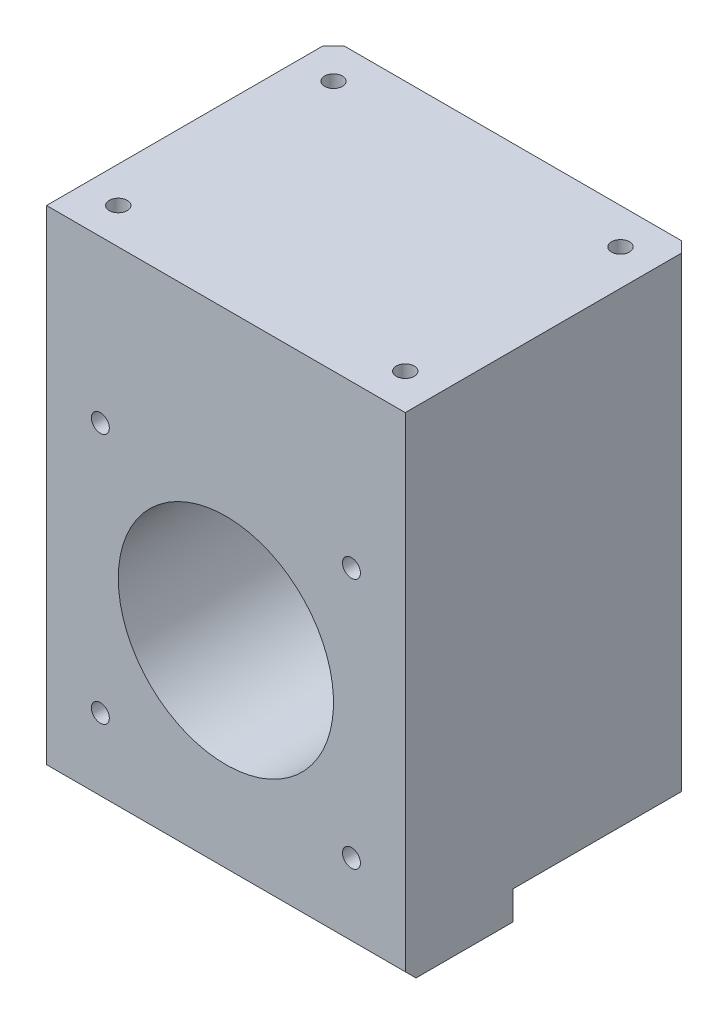
ISO-10303-21;
HEADER;
FILE_DESCRIPTION(('STEP AP214'),'2;1');
FILE_NAME('part.step','',(''),(''),'','','');
FILE_SCHEMA(('AUTOMOTIVE_DESIGN { 1 0 10303 214 1 1 1 1 }'));
ENDSEC;
DATA;
#1=APPLICATION_CONTEXT('core data for automotive mechanical design processes');
#2=APPLICATION_PROTOCOL_DEFINITION('international standard','automotive_design',2000,#1);
#3=PRODUCT_CONTEXT('',#1,'mechanical');
#4=PRODUCT('Part','Part','',(#3));
#5=PRODUCT_RELATED_PRODUCT_CATEGORY('part','',(#4));
#6=PRODUCT_DEFINITION_FORMATION('','',#4);
#7=PRODUCT_DEFINITION_CONTEXT('part definition',#1,'design');
#8=PRODUCT_DEFINITION('design','',#6,#7);
#9=PRODUCT_DEFINITION_SHAPE('','',#8);
#10=(LENGTH_UNIT() NAMED_UNIT(*) SI_UNIT(.MILLI.,.METRE.));
#11=(NAMED_UNIT(*) PLANE_ANGLE_UNIT() SI_UNIT($,.RADIAN.));
#12=(NAMED_UNIT(*) SI_UNIT($,.STERADIAN.) SOLID_ANGLE_UNIT());
#13=UNCERTAINTY_MEASURE_WITH_UNIT(LENGTH_MEASURE(1.E-05),#10,'distance_accuracy_value','');
#14=(GEOMETRIC_REPRESENTATION_CONTEXT(3) GLOBAL_UNCERTAINTY_ASSIGNED_CONTEXT((#13)) GLOBAL_UNIT_ASSIGNED_CONTEXT((#10,
#11,#12)) REPRESENTATION_CONTEXT('',''));
#15=CARTESIAN_POINT('',(0.,0.,0.));
#16=DIRECTION('',(0.,0.,1.));
#17=DIRECTION('',(1.,0.,0.));
#18=AXIS2_PLACEMENT_3D('',#15,#16,#17);
#19=CARTESIAN_POINT('',(-50.,138.,40.));
#20=DIRECTION('',(0.,0.,-1.));
#21=DIRECTION('',(-1.,0.,0.));
#22=AXIS2_PLACEMENT_3D('',#19,#20,#21);
#23=PLANE('',#22);
#24=CARTESIAN_POINT('',(35.,93.,40.));
#25=DIRECTION('',(0.,0.,1.));
#26=DIRECTION('',(1.,0.,0.));
#27=AXIS2_PLACEMENT_3D('',#24,#25,#26);
#28=CIRCLE('',#27,2.49999999999999);
#29=CARTESIAN_POINT('',(37.5,93.,40.));
#30=VERTEX_POINT('',#29);
#31=EDGE_CURVE('E178',#30,#30,#28,.T.);
#32=ORIENTED_EDGE('',*,*,#31,.F.);
#33=EDGE_LOOP('',(#32));
#34=FACE_BOUND('',#33,.T.);
#35=CARTESIAN_POINT('',(35.,23.,40.));
#36=DIRECTION('',(0.,0.,1.));
#37=DIRECTION('',(1.,0.,0.));
#38=AXIS2_PLACEMENT_3D('',#35,#36,#37);
#39=CIRCLE('',#38,2.49999999999999);
#40=CARTESIAN_POINT('',(37.5,23.,40.));
#41=VERTEX_POINT('',#40);
#42=EDGE_CURVE('E192',#41,#41,#39,.T.);
#43=ORIENTED_EDGE('',*,*,#42,.F.);
#44=EDGE_LOOP('',(#43));
#45=FACE_BOUND('',#44,.T.);
#46=CARTESIAN_POINT('',(-35.,23.,40.));
#47=DIRECTION('',(0.,0.,1.));
#48=DIRECTION('',(1.,0.,0.));
#49=AXIS2_PLACEMENT_3D('',#46,#47,#48);
#50=CIRCLE('',#49,2.49999999999999);
#51=CARTESIAN_POINT('',(-32.5,23.,40.));
#52=VERTEX_POINT('',#51);
#53=EDGE_CURVE('E200',#52,#52,#50,.T.);
#54=ORIENTED_EDGE('',*,*,#53,.F.);
#55=EDGE_LOOP('',(#54));
#56=FACE_BOUND('',#55,.T.);
#57=CARTESIAN_POINT('',(0.,58.,40.));
#58=DIRECTION('',(0.,0.,-1.));
#59=DIRECTION('',(-1.,0.,0.));
#60=AXIS2_PLACEMENT_3D('',#57,#58,#59);
#61=CIRCLE('',#60,30.);
#62=CARTESIAN_POINT('',(-30.,58.,40.));
#63=VERTEX_POINT('',#62);
#64=EDGE_CURVE('E273',#63,#63,#61,.T.);
#65=ORIENTED_EDGE('',*,*,#64,.T.);
#66=EDGE_LOOP('',(#65));
#67=FACE_BOUND('',#66,.T.);
#68=DIRECTION('',(0.,-1.,0.));
#69=VECTOR('',#68,1.);
#70=CARTESIAN_POINT('',(-50.,138.,40.));
#71=LINE('',#70,#69);
#72=CARTESIAN_POINT('',(-50.,138.,40.));
#73=VERTEX_POINT('',#72);
#74=CARTESIAN_POINT('',(-50.,3.,40.));
#75=VERTEX_POINT('',#74);
#76=EDGE_CURVE('E361',#73,#75,#71,.T.);
#77=ORIENTED_EDGE('',*,*,#76,.T.);
#78=DIRECTION('',(1.,0.,0.));
#79=VECTOR('',#78,1.);
#80=CARTESIAN_POINT('',(50.,3.,40.));
#81=LINE('',#80,#79);
#82=CARTESIAN_POINT('',(50.,3.,40.));
#83=VERTEX_POINT('',#82);
#84=EDGE_CURVE('E365',#75,#83,#81,.T.);
#85=ORIENTED_EDGE('',*,*,#84,.T.);
#86=DIRECTION('',(0.,-1.,0.));
#87=VECTOR('',#86,1.);
#88=CARTESIAN_POINT('',(50.,138.,40.));
#89=LINE('',#88,#87);
#90=CARTESIAN_POINT('',(50.,138.,40.));
#91=VERTEX_POINT('',#90);
#92=EDGE_CURVE('E352',#91,#83,#89,.T.);
#93=ORIENTED_EDGE('',*,*,#92,.F.);
#94=DIRECTION('',(1.,0.,0.));
#95=VECTOR('',#94,1.);
#96=CARTESIAN_POINT('',(-50.,138.,40.));
#97=LINE('',#96,#95);
#98=EDGE_CURVE('E349',#73,#91,#97,.T.);
#99=ORIENTED_EDGE('',*,*,#98,.F.);
#100=EDGE_LOOP('',(#77,#85,#93,#99));
#101=FACE_BOUND('',#100,.T.);
#102=CARTESIAN_POINT('',(-35.,93.,40.));
#103=DIRECTION('',(0.,0.,1.));
#104=DIRECTION('',(1.,0.,0.));
#105=AXIS2_PLACEMENT_3D('',#102,#103,#104);
#106=CIRCLE('',#105,2.49999999999999);
#107=CARTESIAN_POINT('',(-32.5,93.,40.));
#108=VERTEX_POINT('',#107);
#109=EDGE_CURVE('E179',#108,#108,#106,.T.);
#110=ORIENTED_EDGE('',*,*,#109,.F.);
#111=EDGE_LOOP('',(#110));
#112=FACE_BOUND('',#111,.T.);
#113=ADVANCED_FACE('F48',(#34,#45,#56,#67,#101,#112),#23,.F.);
#114=CARTESIAN_POINT('',(50.,138.,40.));
#115=DIRECTION('',(-1.,0.,0.));
#116=DIRECTION('',(0.,0.,1.));
#117=AXIS2_PLACEMENT_3D('',#114,#115,#116);
#118=PLANE('',#117);
#119=ORIENTED_EDGE('',*,*,#92,.T.);
#120=DIRECTION('',(0.,-0.707106781186548,-0.707106781186548));
#121=VECTOR('',#120,1.);
#122=CARTESIAN_POINT('',(50.,3.,40.));
#123=LINE('',#122,#121);
#124=CARTESIAN_POINT('',(50.,0.,37.));
#125=VERTEX_POINT('',#124);
#126=EDGE_CURVE('E372',#83,#125,#123,.T.);
#127=ORIENTED_EDGE('',*,*,#126,.T.);
#128=DIRECTION('',(0.,0.,-1.));
#129=VECTOR('',#128,1.);
#130=CARTESIAN_POINT('',(50.,0.,40.));
#131=LINE('',#130,#129);
#132=CARTESIAN_POINT('',(50.,0.,10.));
#133=VERTEX_POINT('',#132);
#134=EDGE_CURVE('E335',#125,#133,#131,.T.);
#135=ORIENTED_EDGE('',*,*,#134,.T.);
#136=DIRECTION('',(0.,-1.,0.));
#137=VECTOR('',#136,1.);
#138=CARTESIAN_POINT('',(50.,8.,10.));
#139=LINE('',#138,#137);
#140=CARTESIAN_POINT('',(50.,8.,10.));
#141=VERTEX_POINT('',#140);
#142=EDGE_CURVE('E328',#141,#133,#139,.T.);
#143=ORIENTED_EDGE('',*,*,#142,.F.);
#144=DIRECTION('',(0.,0.,1.));
#145=VECTOR('',#144,1.);
#146=CARTESIAN_POINT('',(50.,8.,-40.));
#147=LINE('',#146,#145);
#148=CARTESIAN_POINT('',(50.,8.,-37.));
#149=VERTEX_POINT('',#148);
#150=EDGE_CURVE('E321',#149,#141,#147,.T.);
#151=ORIENTED_EDGE('',*,*,#150,.F.);
#152=DIRECTION('',(0.,1.,0.));
#153=VECTOR('',#152,1.);
#154=CARTESIAN_POINT('',(50.,138.,-37.));
#155=LINE('',#154,#153);
#156=CARTESIAN_POINT('',(50.,138.,-37.));
#157=VERTEX_POINT('',#156);
#158=EDGE_CURVE('E369',#149,#157,#155,.T.);
#159=ORIENTED_EDGE('',*,*,#158,.T.);
#160=DIRECTION('',(0.,0.,-1.));
#161=VECTOR('',#160,1.);
#162=CARTESIAN_POINT('',(50.,138.,40.));
#163=LINE('',#162,#161);
#164=EDGE_CURVE('E339',#91,#157,#163,.T.);
#165=ORIENTED_EDGE('',*,*,#164,.F.);
#166=EDGE_LOOP('',(#119,#127,#135,#143,#151,#159,#165));
#167=FACE_BOUND('',#166,.T.);
#168=ADVANCED_FACE('F420',(#167),#118,.F.);
#169=CARTESIAN_POINT('',(-50.,138.,-40.));
#170=DIRECTION('',(0.,0.,1.));
#171=DIRECTION('',(1.,0.,0.));
#172=AXIS2_PLACEMENT_3D('',#169,#170,#171);
#173=PLANE('',#172);
#174=CARTESIAN_POINT('',(35.,23.,-40.));
#175=DIRECTION('',(0.,0.,-1.));
#176=DIRECTION('',(-1.,0.,0.));
#177=AXIS2_PLACEMENT_3D('',#174,#175,#176);
#178=CIRCLE('',#177,2.49999999999999);
#179=CARTESIAN_POINT('',(32.5,23.,-40.));
#180=VERTEX_POINT('',#179);
#181=EDGE_CURVE('E208',#180,#180,#178,.T.);
#182=ORIENTED_EDGE('',*,*,#181,.F.);
#183=EDGE_LOOP('',(#182));
#184=FACE_BOUND('',#183,.T.);
#185=CARTESIAN_POINT('',(35.,93.,-40.));
#186=DIRECTION('',(0.,0.,-1.));
#187=DIRECTION('',(-1.,0.,0.));
#188=AXIS2_PLACEMENT_3D('',#185,#186,#187);
#189=CIRCLE('',#188,2.49999999999999);
#190=CARTESIAN_POINT('',(32.5,93.,-40.));
#191=VERTEX_POINT('',#190);
#192=EDGE_CURVE('E216',#191,#191,#189,.T.);
#193=ORIENTED_EDGE('',*,*,#192,.F.);
#194=EDGE_LOOP('',(#193));
#195=FACE_BOUND('',#194,.T.);
#196=CARTESIAN_POINT('',(-35.,93.,-40.));
#197=DIRECTION('',(0.,0.,-1.));
#198=DIRECTION('',(-1.,0.,0.));
#199=AXIS2_PLACEMENT_3D('',#196,#197,#198);
#200=CIRCLE('',#199,2.49999999999999);
#201=CARTESIAN_POINT('',(-37.5,93.,-40.));
#202=VERTEX_POINT('',#201);
#203=EDGE_CURVE('E224',#202,#202,#200,.T.);
#204=ORIENTED_EDGE('',*,*,#203,.F.);
#205=EDGE_LOOP('',(#204));
#206=FACE_BOUND('',#205,.T.);
#207=CARTESIAN_POINT('',(-35.,23.,-40.));
#208=DIRECTION('',(0.,0.,-1.));
#209=DIRECTION('',(-1.,0.,0.));
#210=AXIS2_PLACEMENT_3D('',#207,#208,#209);
#211=CIRCLE('',#210,2.49999999999999);
#212=CARTESIAN_POINT('',(-37.5,23.,-40.));
#213=VERTEX_POINT('',#212);
#214=EDGE_CURVE('E232',#213,#213,#211,.T.);
#215=ORIENTED_EDGE('',*,*,#214,.F.);
#216=EDGE_LOOP('',(#215));
#217=FACE_BOUND('',#216,.T.);
#218=CARTESIAN_POINT('',(0.,58.,-40.));
#219=DIRECTION('',(0.,0.,-1.));
#220=DIRECTION('',(-1.,0.,0.));
#221=AXIS2_PLACEMENT_3D('',#218,#219,#220);
#222=CIRCLE('',#221,30.);
#223=CARTESIAN_POINT('',(-30.,58.,-40.));
#224=VERTEX_POINT('',#223);
#225=EDGE_CURVE('E272',#224,#224,#222,.T.);
#226=ORIENTED_EDGE('',*,*,#225,.F.);
#227=EDGE_LOOP('',(#226));
#228=FACE_BOUND('',#227,.T.);
#229=DIRECTION('',(1.,0.,0.));
#230=VECTOR('',#229,1.);
#231=CARTESIAN_POINT('',(-50.,8.,-40.));
#232=LINE('',#231,#230);
#233=CARTESIAN_POINT('',(-47.,8.,-40.));
#234=VERTEX_POINT('',#233);
#235=CARTESIAN_POINT('',(47.,8.,-40.));
#236=VERTEX_POINT('',#235);
#237=EDGE_CURVE('E317',#234,#236,#232,.T.);
#238=ORIENTED_EDGE('',*,*,#237,.F.);
#239=DIRECTION('',(0.,1.,0.));
#240=VECTOR('',#239,1.);
#241=CARTESIAN_POINT('',(-47.,138.,-40.));
#242=LINE('',#241,#240);
#243=CARTESIAN_POINT('',(-47.,138.,-40.));
#244=VERTEX_POINT('',#243);
#245=EDGE_CURVE('E65',#234,#244,#242,.T.);
#246=ORIENTED_EDGE('',*,*,#245,.T.);
#247=DIRECTION('',(-1.,0.,0.));
#248=VECTOR('',#247,1.);
#249=CARTESIAN_POINT('',(-50.,138.,-40.));
#250=LINE('',#249,#248);
#251=CARTESIAN_POINT('',(47.,138.,-40.));
#252=VERTEX_POINT('',#251);
#253=EDGE_CURVE('E342',#252,#244,#250,.T.);
#254=ORIENTED_EDGE('',*,*,#253,.F.);
#255=DIRECTION('',(0.,-1.,0.));
#256=VECTOR('',#255,1.);
#257=CARTESIAN_POINT('',(47.,138.,-40.));
#258=LINE('',#257,#256);
#259=EDGE_CURVE('E391',#252,#236,#258,.T.);
#260=ORIENTED_EDGE('',*,*,#259,.T.);
#261=EDGE_LOOP('',(#238,#246,#254,#260));
#262=FACE_BOUND('',#261,.T.);
#263=ADVANCED_FACE('F398',(#184,#195,#206,#217,#228,#262),#173,.F.);
#264=CARTESIAN_POINT('',(-50.,138.,40.));
#265=DIRECTION('',(1.,0.,0.));
#266=DIRECTION('',(0.,0.,-1.));
#267=AXIS2_PLACEMENT_3D('',#264,#265,#266);
#268=PLANE('',#267);
#269=DIRECTION('',(0.,0.,1.));
#270=VECTOR('',#269,1.);
#271=CARTESIAN_POINT('',(-50.,0.,40.));
#272=LINE('',#271,#270);
#273=CARTESIAN_POINT('',(-50.,0.,10.));
#274=VERTEX_POINT('',#273);
#275=CARTESIAN_POINT('',(-50.,0.,37.));
#276=VERTEX_POINT('',#275);
#277=EDGE_CURVE('E343',#274,#276,#272,.T.);
#278=ORIENTED_EDGE('',*,*,#277,.T.);
#279=DIRECTION('',(0.,0.707106781186548,0.707106781186548));
#280=VECTOR('',#279,1.);
#281=CARTESIAN_POINT('',(-50.,3.,40.));
#282=LINE('',#281,#280);
#283=EDGE_CURVE('E382',#276,#75,#282,.T.);
#284=ORIENTED_EDGE('',*,*,#283,.T.);
#285=ORIENTED_EDGE('',*,*,#76,.F.);
#286=DIRECTION('',(0.,0.,1.));
#287=VECTOR('',#286,1.);
#288=CARTESIAN_POINT('',(-50.,138.,40.));
#289=LINE('',#288,#287);
#290=CARTESIAN_POINT('',(-50.,138.,-37.));
#291=VERTEX_POINT('',#290);
#292=EDGE_CURVE('E346',#291,#73,#289,.T.);
#293=ORIENTED_EDGE('',*,*,#292,.F.);
#294=DIRECTION('',(0.,-1.,0.));
#295=VECTOR('',#294,1.);
#296=CARTESIAN_POINT('',(-50.,138.,-37.));
#297=LINE('',#296,#295);
#298=CARTESIAN_POINT('',(-50.,8.,-37.));
#299=VERTEX_POINT('',#298);
#300=EDGE_CURVE('E378',#291,#299,#297,.T.);
#301=ORIENTED_EDGE('',*,*,#300,.T.);
#302=DIRECTION('',(0.,0.,-1.));
#303=VECTOR('',#302,1.);
#304=CARTESIAN_POINT('',(-50.,8.,-40.));
#305=LINE('',#304,#303);
#306=CARTESIAN_POINT('',(-50.,8.,10.));
#307=VERTEX_POINT('',#306);
#308=EDGE_CURVE('E313',#307,#299,#305,.T.);
#309=ORIENTED_EDGE('',*,*,#308,.F.);
#310=DIRECTION('',(0.,-1.,0.));
#311=VECTOR('',#310,1.);
#312=CARTESIAN_POINT('',(-50.,8.,10.));
#313=LINE('',#312,#311);
#314=EDGE_CURVE('E331',#307,#274,#313,.T.);
#315=ORIENTED_EDGE('',*,*,#314,.T.);
#316=EDGE_LOOP('',(#278,#284,#285,#293,#301,#309,#315));
#317=FACE_BOUND('',#316,.T.);
#318=ADVANCED_FACE('F410',(#317),#268,.F.);
#319=CARTESIAN_POINT('',(0.,138.,0.));
#320=DIRECTION('',(0.,-1.,0.));
#321=DIRECTION('',(0.,0.,-1.));
#322=AXIS2_PLACEMENT_3D('',#319,#320,#321);
#323=PLANE('',#322);
#324=CARTESIAN_POINT('',(-40.,138.,-30.));
#325=DIRECTION('',(0.,1.,0.));
#326=DIRECTION('',(0.,0.,1.));
#327=AXIS2_PLACEMENT_3D('',#324,#325,#326);
#328=CIRCLE('',#327,2.49999999999999);
#329=CARTESIAN_POINT('',(-40.,138.,-27.5));
#330=VERTEX_POINT('',#329);
#331=EDGE_CURVE('E240',#330,#330,#328,.T.);
#332=ORIENTED_EDGE('',*,*,#331,.F.);
#333=EDGE_LOOP('',(#332));
#334=FACE_BOUND('',#333,.T.);
#335=CARTESIAN_POINT('',(-40.,138.,30.));
#336=DIRECTION('',(0.,1.,0.));
#337=DIRECTION('',(0.,0.,1.));
#338=AXIS2_PLACEMENT_3D('',#335,#336,#337);
#339=CIRCLE('',#338,2.49999999999999);
#340=CARTESIAN_POINT('',(-40.,138.,32.5));
#341=VERTEX_POINT('',#340);
#342=EDGE_CURVE('E248',#341,#341,#339,.T.);
#343=ORIENTED_EDGE('',*,*,#342,.F.);
#344=EDGE_LOOP('',(#343));
#345=FACE_BOUND('',#344,.T.);
#346=CARTESIAN_POINT('',(40.,138.,30.));
#347=DIRECTION('',(0.,1.,0.));
#348=DIRECTION('',(0.,0.,1.));
#349=AXIS2_PLACEMENT_3D('',#346,#347,#348);
#350=CIRCLE('',#349,2.49999999999999);
#351=CARTESIAN_POINT('',(40.,138.,32.5));
#352=VERTEX_POINT('',#351);
#353=EDGE_CURVE('E256',#352,#352,#350,.T.);
#354=ORIENTED_EDGE('',*,*,#353,.F.);
#355=EDGE_LOOP('',(#354));
#356=FACE_BOUND('',#355,.T.);
#357=CARTESIAN_POINT('',(40.,138.,-30.));
#358=DIRECTION('',(0.,1.,0.));
#359=DIRECTION('',(0.,0.,1.));
#360=AXIS2_PLACEMENT_3D('',#357,#358,#359);
#361=CIRCLE('',#360,2.49999999999999);
#362=CARTESIAN_POINT('',(40.,138.,-27.5));
#363=VERTEX_POINT('',#362);
#364=EDGE_CURVE('E264',#363,#363,#361,.T.);
#365=ORIENTED_EDGE('',*,*,#364,.F.);
#366=EDGE_LOOP('',(#365));
#367=FACE_BOUND('',#366,.T.);
#368=ORIENTED_EDGE('',*,*,#253,.T.);
#369=DIRECTION('',(0.707106781186551,0.,-0.707106781186544));
#370=VECTOR('',#369,1.);
#371=CARTESIAN_POINT('',(-50.,138.,-37.));
#372=LINE('',#371,#370);
#373=EDGE_CURVE('E11',#244,#291,#372,.F.);
#374=ORIENTED_EDGE('',*,*,#373,.T.);
#375=ORIENTED_EDGE('',*,*,#292,.T.);
#376=ORIENTED_EDGE('',*,*,#98,.T.);
#377=ORIENTED_EDGE('',*,*,#164,.T.);
#378=DIRECTION('',(0.707106781186544,0.,0.707106781186551));
#379=VECTOR('',#378,1.);
#380=CARTESIAN_POINT('',(47.,138.,-40.));
#381=LINE('',#380,#379);
#382=EDGE_CURVE('E58',#157,#252,#381,.F.);
#383=ORIENTED_EDGE('',*,*,#382,.T.);
#384=EDGE_LOOP('',(#368,#374,#375,#376,#377,#383));
#385=FACE_BOUND('',#384,.T.);
#386=ADVANCED_FACE('F413',(#334,#345,#356,#367,#385),#323,.F.);
#387=CARTESIAN_POINT('',(0.,0.,0.));
#388=DIRECTION('',(0.,-1.,0.));
#389=DIRECTION('',(0.,0.,-1.));
#390=AXIS2_PLACEMENT_3D('',#387,#388,#389);
#391=PLANE('',#390);
#392=ORIENTED_EDGE('',*,*,#134,.F.);
#393=DIRECTION('',(-1.,0.,0.));
#394=VECTOR('',#393,1.);
#395=CARTESIAN_POINT('',(-50.,0.,37.));
#396=LINE('',#395,#394);
#397=EDGE_CURVE('E375',#125,#276,#396,.T.);
#398=ORIENTED_EDGE('',*,*,#397,.T.);
#399=ORIENTED_EDGE('',*,*,#277,.F.);
#400=DIRECTION('',(-1.,0.,0.));
#401=VECTOR('',#400,1.);
#402=CARTESIAN_POINT('',(-50.,0.,10.));
#403=LINE('',#402,#401);
#404=EDGE_CURVE('E312',#133,#274,#403,.T.);
#405=ORIENTED_EDGE('',*,*,#404,.F.);
#406=EDGE_LOOP('',(#392,#398,#399,#405));
#407=FACE_BOUND('',#406,.T.);
#408=ADVANCED_FACE('F439',(#407),#391,.T.);
#409=CARTESIAN_POINT('',(-50.,8.,10.));
#410=DIRECTION('',(0.,0.,1.));
#411=DIRECTION('',(1.,0.,0.));
#412=AXIS2_PLACEMENT_3D('',#409,#410,#411);
#413=PLANE('',#412);
#414=ORIENTED_EDGE('',*,*,#404,.T.);
#415=ORIENTED_EDGE('',*,*,#314,.F.);
#416=DIRECTION('',(-1.,0.,0.));
#417=VECTOR('',#416,1.);
#418=CARTESIAN_POINT('',(-50.,8.,10.));
#419=LINE('',#418,#417);
#420=EDGE_CURVE('E324',#141,#307,#419,.T.);
#421=ORIENTED_EDGE('',*,*,#420,.F.);
#422=ORIENTED_EDGE('',*,*,#142,.T.);
#423=EDGE_LOOP('',(#414,#415,#421,#422));
#424=FACE_BOUND('',#423,.T.);
#425=ADVANCED_FACE('F468',(#424),#413,.F.);
#426=CARTESIAN_POINT('',(0.,8.,0.));
#427=DIRECTION('',(0.,1.,0.));
#428=DIRECTION('',(0.,0.,1.));
#429=AXIS2_PLACEMENT_3D('',#426,#427,#428);
#430=PLANE('',#429);
#431=CARTESIAN_POINT('',(40.,8.,-25.));
#432=DIRECTION('',(0.,-1.,0.));
#433=DIRECTION('',(0.,0.,-1.));
#434=AXIS2_PLACEMENT_3D('',#431,#432,#433);
#435=CIRCLE('',#434,2.49999999999999);
#436=CARTESIAN_POINT('',(40.,8.,-27.5));
#437=VERTEX_POINT('',#436);
#438=EDGE_CURVE('E277',#437,#437,#435,.T.);
#439=ORIENTED_EDGE('',*,*,#438,.F.);
#440=EDGE_LOOP('',(#439));
#441=FACE_BOUND('',#440,.T.);
#442=CARTESIAN_POINT('',(40.,8.,0.));
#443=DIRECTION('',(0.,-1.,0.));
#444=DIRECTION('',(0.,0.,-1.));
#445=AXIS2_PLACEMENT_3D('',#442,#443,#444);
#446=CIRCLE('',#445,2.49999999999999);
#447=CARTESIAN_POINT('',(40.,8.,-2.49999999999998));
#448=VERTEX_POINT('',#447);
#449=EDGE_CURVE('E288',#448,#448,#446,.T.);
#450=ORIENTED_EDGE('',*,*,#449,.F.);
#451=EDGE_LOOP('',(#450));
#452=FACE_BOUND('',#451,.T.);
#453=CARTESIAN_POINT('',(-40.,8.,0.));
#454=DIRECTION('',(0.,-1.,0.));
#455=DIRECTION('',(0.,0.,-1.));
#456=AXIS2_PLACEMENT_3D('',#453,#454,#455);
#457=CIRCLE('',#456,2.49999999999999);
#458=CARTESIAN_POINT('',(-40.,8.,-2.49999999999998));
#459=VERTEX_POINT('',#458);
#460=EDGE_CURVE('E296',#459,#459,#457,.T.);
#461=ORIENTED_EDGE('',*,*,#460,.F.);
#462=EDGE_LOOP('',(#461));
#463=FACE_BOUND('',#462,.T.);
#464=CARTESIAN_POINT('',(-40.,8.,-25.));
#465=DIRECTION('',(0.,-1.,0.));
#466=DIRECTION('',(0.,0.,-1.));
#467=AXIS2_PLACEMENT_3D('',#464,#465,#466);
#468=CIRCLE('',#467,2.49999999999999);
#469=CARTESIAN_POINT('',(-40.,8.,-27.5));
#470=VERTEX_POINT('',#469);
#471=EDGE_CURVE('E304',#470,#470,#468,.T.);
#472=ORIENTED_EDGE('',*,*,#471,.F.);
#473=EDGE_LOOP('',(#472));
#474=FACE_BOUND('',#473,.T.);
#475=ORIENTED_EDGE('',*,*,#308,.T.);
#476=DIRECTION('',(-0.707106781186551,0.,0.707106781186544));
#477=VECTOR('',#476,1.);
#478=CARTESIAN_POINT('',(-50.,8.00000000000001,-37.));
#479=LINE('',#478,#477);
#480=EDGE_CURVE('E388',#299,#234,#479,.F.);
#481=ORIENTED_EDGE('',*,*,#480,.T.);
#482=ORIENTED_EDGE('',*,*,#237,.T.);
#483=DIRECTION('',(-0.707106781186544,0.,-0.707106781186551));
#484=VECTOR('',#483,1.);
#485=CARTESIAN_POINT('',(47.,8.00000000000001,-40.));
#486=LINE('',#485,#484);
#487=EDGE_CURVE('E385',#236,#149,#486,.F.);
#488=ORIENTED_EDGE('',*,*,#487,.T.);
#489=ORIENTED_EDGE('',*,*,#150,.T.);
#490=ORIENTED_EDGE('',*,*,#420,.T.);
#491=EDGE_LOOP('',(#475,#481,#482,#488,#489,#490));
#492=FACE_BOUND('',#491,.T.);
#493=ADVANCED_FACE('F401',(#441,#452,#463,#474,#492),#430,.F.);
#494=CARTESIAN_POINT('',(-40.,23.,-25.));
#495=DIRECTION('',(0.,-1.,0.));
#496=DIRECTION('',(0.,0.,-1.));
#497=AXIS2_PLACEMENT_3D('',#494,#495,#496);
#498=CONICAL_SURFACE('',#497,2.49999999999999,1.02974425867665);
#499=CARTESIAN_POINT('',(-40.,24.5021515475689,-25.));
#500=VERTEX_POINT('',#499);
#501=VERTEX_LOOP('',#500);
#502=FACE_BOUND('',#501,.T.);
#503=CARTESIAN_POINT('',(-40.,23.,-25.));
#504=DIRECTION('',(0.,-1.,0.));
#505=DIRECTION('',(0.,0.,-1.));
#506=AXIS2_PLACEMENT_3D('',#503,#504,#505);
#507=CIRCLE('',#506,2.49999999999999);
#508=CARTESIAN_POINT('',(-40.,23.,-27.5));
#509=VERTEX_POINT('',#508);
#510=EDGE_CURVE('E308',#509,#509,#507,.T.);
#511=ORIENTED_EDGE('',*,*,#510,.T.);
#512=EDGE_LOOP('',(#511));
#513=FACE_BOUND('',#512,.T.);
#514=ADVANCED_FACE('F475',(#502,#513),#498,.F.);
#515=CARTESIAN_POINT('',(-40.,8.,-25.));
#516=DIRECTION('',(0.,-1.,0.));
#517=DIRECTION('',(0.,0.,-1.));
#518=AXIS2_PLACEMENT_3D('',#515,#516,#517);
#519=CYLINDRICAL_SURFACE('',#518,2.49999999999999);
#520=ORIENTED_EDGE('',*,*,#510,.F.);
#521=EDGE_LOOP('',(#520));
#522=FACE_BOUND('',#521,.T.);
#523=ORIENTED_EDGE('',*,*,#471,.T.);
#524=EDGE_LOOP('',(#523));
#525=FACE_BOUND('',#524,.T.);
#526=ADVANCED_FACE('F536',(#522,#525),#519,.F.);
#527=CARTESIAN_POINT('',(-40.,23.,0.));
#528=DIRECTION('',(0.,-1.,0.));
#529=DIRECTION('',(0.,0.,-1.));
#530=AXIS2_PLACEMENT_3D('',#527,#528,#529);
#531=CONICAL_SURFACE('',#530,2.49999999999999,1.02974425867665);
#532=CARTESIAN_POINT('',(-40.,24.5021515475689,0.));
#533=VERTEX_POINT('',#532);
#534=VERTEX_LOOP('',#533);
#535=FACE_BOUND('',#534,.T.);
#536=CARTESIAN_POINT('',(-40.,23.,0.));
#537=DIRECTION('',(0.,-1.,0.));
#538=DIRECTION('',(0.,0.,-1.));
#539=AXIS2_PLACEMENT_3D('',#536,#537,#538);
#540=CIRCLE('',#539,2.49999999999999);
#541=CARTESIAN_POINT('',(-40.,23.,-2.49999999999998));
#542=VERTEX_POINT('',#541);
#543=EDGE_CURVE('E300',#542,#542,#540,.T.);
#544=ORIENTED_EDGE('',*,*,#543,.T.);
#545=EDGE_LOOP('',(#544));
#546=FACE_BOUND('',#545,.T.);
#547=ADVANCED_FACE('F532',(#535,#546),#531,.F.);
#548=CARTESIAN_POINT('',(-40.,8.,0.));
#549=DIRECTION('',(0.,-1.,0.));
#550=DIRECTION('',(0.,0.,-1.));
#551=AXIS2_PLACEMENT_3D('',#548,#549,#550);
#552=CYLINDRICAL_SURFACE('',#551,2.49999999999999);
#553=ORIENTED_EDGE('',*,*,#543,.F.);
#554=EDGE_LOOP('',(#553));
#555=FACE_BOUND('',#554,.T.);
#556=ORIENTED_EDGE('',*,*,#460,.T.);
#557=EDGE_LOOP('',(#556));
#558=FACE_BOUND('',#557,.T.);
#559=ADVANCED_FACE('F528',(#555,#558),#552,.F.);
#560=CARTESIAN_POINT('',(40.,23.,0.));
#561=DIRECTION('',(0.,-1.,0.));
#562=DIRECTION('',(0.,0.,-1.));
#563=AXIS2_PLACEMENT_3D('',#560,#561,#562);
#564=CONICAL_SURFACE('',#563,2.49999999999999,1.02974425867665);
#565=CARTESIAN_POINT('',(40.,24.5021515475689,0.));
#566=VERTEX_POINT('',#565);
#567=VERTEX_LOOP('',#566);
#568=FACE_BOUND('',#567,.T.);
#569=CARTESIAN_POINT('',(40.,23.,0.));
#570=DIRECTION('',(0.,-1.,0.));
#571=DIRECTION('',(0.,0.,-1.));
#572=AXIS2_PLACEMENT_3D('',#569,#570,#571);
#573=CIRCLE('',#572,2.49999999999999);
#574=CARTESIAN_POINT('',(40.,23.,-2.49999999999998));
#575=VERTEX_POINT('',#574);
#576=EDGE_CURVE('E292',#575,#575,#573,.T.);
#577=ORIENTED_EDGE('',*,*,#576,.T.);
#578=EDGE_LOOP('',(#577));
#579=FACE_BOUND('',#578,.T.);
#580=ADVANCED_FACE('F524',(#568,#579),#564,.F.);
#581=CARTESIAN_POINT('',(40.,8.,0.));
#582=DIRECTION('',(0.,-1.,0.));
#583=DIRECTION('',(0.,0.,-1.));
#584=AXIS2_PLACEMENT_3D('',#581,#582,#583);
#585=CYLINDRICAL_SURFACE('',#584,2.49999999999999);
#586=ORIENTED_EDGE('',*,*,#576,.F.);
#587=EDGE_LOOP('',(#586));
#588=FACE_BOUND('',#587,.T.);
#589=ORIENTED_EDGE('',*,*,#449,.T.);
#590=EDGE_LOOP('',(#589));
#591=FACE_BOUND('',#590,.T.);
#592=ADVANCED_FACE('F520',(#588,#591),#585,.F.);
#593=CARTESIAN_POINT('',(40.,23.,-25.));
#594=DIRECTION('',(0.,-1.,0.));
#595=DIRECTION('',(0.,0.,-1.));
#596=AXIS2_PLACEMENT_3D('',#593,#594,#595);
#597=CONICAL_SURFACE('',#596,2.49999999999999,1.02974425867665);
#598=CARTESIAN_POINT('',(40.,24.5021515475689,-25.));
#599=VERTEX_POINT('',#598);
#600=VERTEX_LOOP('',#599);
#601=FACE_BOUND('',#600,.T.);
#602=CARTESIAN_POINT('',(40.,23.,-25.));
#603=DIRECTION('',(0.,-1.,0.));
#604=DIRECTION('',(0.,0.,-1.));
#605=AXIS2_PLACEMENT_3D('',#602,#603,#604);
#606=CIRCLE('',#605,2.49999999999999);
#607=CARTESIAN_POINT('',(40.,23.,-27.5));
#608=VERTEX_POINT('',#607);
#609=EDGE_CURVE('E284',#608,#608,#606,.T.);
#610=ORIENTED_EDGE('',*,*,#609,.T.);
#611=EDGE_LOOP('',(#610));
#612=FACE_BOUND('',#611,.T.);
#613=ADVANCED_FACE('F516',(#601,#612),#597,.F.);
#614=CARTESIAN_POINT('',(40.,8.,-25.));
#615=DIRECTION('',(0.,-1.,0.));
#616=DIRECTION('',(0.,0.,-1.));
#617=AXIS2_PLACEMENT_3D('',#614,#615,#616);
#618=CYLINDRICAL_SURFACE('',#617,2.49999999999999);
#619=ORIENTED_EDGE('',*,*,#609,.F.);
#620=EDGE_LOOP('',(#619));
#621=FACE_BOUND('',#620,.T.);
#622=ORIENTED_EDGE('',*,*,#438,.T.);
#623=EDGE_LOOP('',(#622));
#624=FACE_BOUND('',#623,.T.);
#625=ADVANCED_FACE('F512',(#621,#624),#618,.F.);
#626=CARTESIAN_POINT('',(0.,58.,40.));
#627=DIRECTION('',(0.,0.,-1.));
#628=DIRECTION('',(-1.,0.,0.));
#629=AXIS2_PLACEMENT_3D('',#626,#627,#628);
#630=CYLINDRICAL_SURFACE('',#629,30.);
#631=ORIENTED_EDGE('',*,*,#64,.F.);
#632=EDGE_LOOP('',(#631));
#633=FACE_BOUND('',#632,.T.);
#634=ORIENTED_EDGE('',*,*,#225,.T.);
#635=EDGE_LOOP('',(#634));
#636=FACE_BOUND('',#635,.T.);
#637=ADVANCED_FACE('F504',(#633,#636),#630,.F.);
#638=CARTESIAN_POINT('',(40.,123.,-30.));
#639=DIRECTION('',(0.,1.,0.));
#640=DIRECTION('',(0.,0.,1.));
#641=AXIS2_PLACEMENT_3D('',#638,#639,#640);
#642=CONICAL_SURFACE('',#641,2.49999999999999,1.02974425867665);
#643=CARTESIAN_POINT('',(40.,121.497848452431,-30.));
#644=VERTEX_POINT('',#643);
#645=VERTEX_LOOP('',#644);
#646=FACE_BOUND('',#645,.T.);
#647=CARTESIAN_POINT('',(40.,123.,-30.));
#648=DIRECTION('',(0.,1.,0.));
#649=DIRECTION('',(0.,0.,1.));
#650=AXIS2_PLACEMENT_3D('',#647,#648,#649);
#651=CIRCLE('',#650,2.49999999999999);
#652=CARTESIAN_POINT('',(40.,123.,-27.5));
#653=VERTEX_POINT('',#652);
#654=EDGE_CURVE('E268',#653,#653,#651,.T.);
#655=ORIENTED_EDGE('',*,*,#654,.T.);
#656=EDGE_LOOP('',(#655));
#657=FACE_BOUND('',#656,.T.);
#658=ADVANCED_FACE('F494',(#646,#657),#642,.F.);
#659=CARTESIAN_POINT('',(40.,138.,-30.));
#660=DIRECTION('',(0.,1.,0.));
#661=DIRECTION('',(0.,0.,1.));
#662=AXIS2_PLACEMENT_3D('',#659,#660,#661);
#663=CYLINDRICAL_SURFACE('',#662,2.49999999999999);
#664=ORIENTED_EDGE('',*,*,#654,.F.);
#665=EDGE_LOOP('',(#664));
#666=FACE_BOUND('',#665,.T.);
#667=ORIENTED_EDGE('',*,*,#364,.T.);
#668=EDGE_LOOP('',(#667));
#669=FACE_BOUND('',#668,.T.);
#670=ADVANCED_FACE('F491',(#666,#669),#663,.F.);
#671=CARTESIAN_POINT('',(40.,123.,30.));
#672=DIRECTION('',(0.,1.,0.));
#673=DIRECTION('',(0.,0.,1.));
#674=AXIS2_PLACEMENT_3D('',#671,#672,#673);
#675=CONICAL_SURFACE('',#674,2.49999999999999,1.02974425867665);
#676=CARTESIAN_POINT('',(40.,121.497848452431,30.));
#677=VERTEX_POINT('',#676);
#678=VERTEX_LOOP('',#677);
#679=FACE_BOUND('',#678,.T.);
#680=CARTESIAN_POINT('',(40.,123.,30.));
#681=DIRECTION('',(0.,1.,0.));
#682=DIRECTION('',(0.,0.,1.));
#683=AXIS2_PLACEMENT_3D('',#680,#681,#682);
#684=CIRCLE('',#683,2.49999999999999);
#685=CARTESIAN_POINT('',(40.,123.,32.5));
#686=VERTEX_POINT('',#685);
#687=EDGE_CURVE('E260',#686,#686,#684,.T.);
#688=ORIENTED_EDGE('',*,*,#687,.T.);
#689=EDGE_LOOP('',(#688));
#690=FACE_BOUND('',#689,.T.);
#691=ADVANCED_FACE('F493',(#679,#690),#675,.F.);
#692=CARTESIAN_POINT('',(40.,138.,30.));
#693=DIRECTION('',(0.,1.,0.));
#694=DIRECTION('',(0.,0.,1.));
#695=AXIS2_PLACEMENT_3D('',#692,#693,#694);
#696=CYLINDRICAL_SURFACE('',#695,2.49999999999999);
#697=ORIENTED_EDGE('',*,*,#687,.F.);
#698=EDGE_LOOP('',(#697));
#699=FACE_BOUND('',#698,.T.);
#700=ORIENTED_EDGE('',*,*,#353,.T.);
#701=EDGE_LOOP('',(#700));
#702=FACE_BOUND('',#701,.T.);
#703=ADVANCED_FACE('F501',(#699,#702),#696,.F.);
#704=CARTESIAN_POINT('',(-40.,123.,30.));
#705=DIRECTION('',(0.,1.,0.));
#706=DIRECTION('',(0.,0.,1.));
#707=AXIS2_PLACEMENT_3D('',#704,#705,#706);
#708=CONICAL_SURFACE('',#707,2.49999999999999,1.02974425867665);
#709=CARTESIAN_POINT('',(-40.,121.497848452431,30.));
#710=VERTEX_POINT('',#709);
#711=VERTEX_LOOP('',#710);
#712=FACE_BOUND('',#711,.T.);
#713=CARTESIAN_POINT('',(-40.,123.,30.));
#714=DIRECTION('',(0.,1.,0.));
#715=DIRECTION('',(0.,0.,1.));
#716=AXIS2_PLACEMENT_3D('',#713,#714,#715);
#717=CIRCLE('',#716,2.49999999999999);
#718=CARTESIAN_POINT('',(-40.,123.,32.5));
#719=VERTEX_POINT('',#718);
#720=EDGE_CURVE('E252',#719,#719,#717,.T.);
#721=ORIENTED_EDGE('',*,*,#720,.T.);
#722=EDGE_LOOP('',(#721));
#723=FACE_BOUND('',#722,.T.);
#724=ADVANCED_FACE('F619',(#712,#723),#708,.F.);
#725=CARTESIAN_POINT('',(-40.,138.,30.));
#726=DIRECTION('',(0.,1.,0.));
#727=DIRECTION('',(0.,0.,1.));
#728=AXIS2_PLACEMENT_3D('',#725,#726,#727);
#729=CYLINDRICAL_SURFACE('',#728,2.49999999999999);
#730=ORIENTED_EDGE('',*,*,#720,.F.);
#731=EDGE_LOOP('',(#730));
#732=FACE_BOUND('',#731,.T.);
#733=ORIENTED_EDGE('',*,*,#342,.T.);
#734=EDGE_LOOP('',(#733));
#735=FACE_BOUND('',#734,.T.);
#736=ADVANCED_FACE('F631',(#732,#735),#729,.F.);
#737=CARTESIAN_POINT('',(-40.,123.,-30.));
#738=DIRECTION('',(0.,1.,0.));
#739=DIRECTION('',(0.,0.,1.));
#740=AXIS2_PLACEMENT_3D('',#737,#738,#739);
#741=CONICAL_SURFACE('',#740,2.49999999999999,1.02974425867665);
#742=CARTESIAN_POINT('',(-40.,121.497848452431,-30.));
#743=VERTEX_POINT('',#742);
#744=VERTEX_LOOP('',#743);
#745=FACE_BOUND('',#744,.T.);
#746=CARTESIAN_POINT('',(-40.,123.,-30.));
#747=DIRECTION('',(0.,1.,0.));
#748=DIRECTION('',(0.,0.,1.));
#749=AXIS2_PLACEMENT_3D('',#746,#747,#748);
#750=CIRCLE('',#749,2.49999999999999);
#751=CARTESIAN_POINT('',(-40.,123.,-27.5));
#752=VERTEX_POINT('',#751);
#753=EDGE_CURVE('E244',#752,#752,#750,.T.);
#754=ORIENTED_EDGE('',*,*,#753,.T.);
#755=EDGE_LOOP('',(#754));
#756=FACE_BOUND('',#755,.T.);
#757=ADVANCED_FACE('F642',(#745,#756),#741,.F.);
#758=CARTESIAN_POINT('',(-40.,138.,-30.));
#759=DIRECTION('',(0.,1.,0.));
#760=DIRECTION('',(0.,0.,1.));
#761=AXIS2_PLACEMENT_3D('',#758,#759,#760);
#762=CYLINDRICAL_SURFACE('',#761,2.49999999999999);
#763=ORIENTED_EDGE('',*,*,#753,.F.);
#764=EDGE_LOOP('',(#763));
#765=FACE_BOUND('',#764,.T.);
#766=ORIENTED_EDGE('',*,*,#331,.T.);
#767=EDGE_LOOP('',(#766));
#768=FACE_BOUND('',#767,.T.);
#769=ADVANCED_FACE('F655',(#765,#768),#762,.F.);
#770=CARTESIAN_POINT('',(-35.,23.,-30.));
#771=DIRECTION('',(0.,0.,-1.));
#772=DIRECTION('',(-1.,0.,0.));
#773=AXIS2_PLACEMENT_3D('',#770,#771,#772);
#774=CONICAL_SURFACE('',#773,2.5,1.02974425867665);
#775=CARTESIAN_POINT('',(-35.,23.,-28.4978484524311));
#776=VERTEX_POINT('',#775);
#777=VERTEX_LOOP('',#776);
#778=FACE_BOUND('',#777,.T.);
#779=CARTESIAN_POINT('',(-35.,23.,-30.));
#780=DIRECTION('',(0.,0.,-1.));
#781=DIRECTION('',(-1.,0.,0.));
#782=AXIS2_PLACEMENT_3D('',#779,#780,#781);
#783=CIRCLE('',#782,2.5);
#784=CARTESIAN_POINT('',(-37.5,23.,-30.));
#785=VERTEX_POINT('',#784);
#786=EDGE_CURVE('E236',#785,#785,#783,.T.);
#787=ORIENTED_EDGE('',*,*,#786,.T.);
#788=EDGE_LOOP('',(#787));
#789=FACE_BOUND('',#788,.T.);
#790=ADVANCED_FACE('F666',(#778,#789),#774,.F.);
#791=CARTESIAN_POINT('',(-35.,23.,-40.));
#792=DIRECTION('',(0.,0.,-1.));
#793=DIRECTION('',(-1.,0.,0.));
#794=AXIS2_PLACEMENT_3D('',#791,#792,#793);
#795=CYLINDRICAL_SURFACE('',#794,2.49999999999999);
#796=ORIENTED_EDGE('',*,*,#786,.F.);
#797=EDGE_LOOP('',(#796));
#798=FACE_BOUND('',#797,.T.);
#799=ORIENTED_EDGE('',*,*,#214,.T.);
#800=EDGE_LOOP('',(#799));
#801=FACE_BOUND('',#800,.T.);
#802=ADVANCED_FACE('F679',(#798,#801),#795,.F.);
#803=CARTESIAN_POINT('',(-35.,93.,-30.));
#804=DIRECTION('',(0.,0.,-1.));
#805=DIRECTION('',(-1.,0.,0.));
#806=AXIS2_PLACEMENT_3D('',#803,#804,#805);
#807=CONICAL_SURFACE('',#806,2.5,1.02974425867665);
#808=CARTESIAN_POINT('',(-35.,93.,-28.4978484524311));
#809=VERTEX_POINT('',#808);
#810=VERTEX_LOOP('',#809);
#811=FACE_BOUND('',#810,.T.);
#812=CARTESIAN_POINT('',(-35.,93.,-30.));
#813=DIRECTION('',(0.,0.,-1.));
#814=DIRECTION('',(-1.,0.,0.));
#815=AXIS2_PLACEMENT_3D('',#812,#813,#814);
#816=CIRCLE('',#815,2.5);
#817=CARTESIAN_POINT('',(-37.5,93.,-30.));
#818=VERTEX_POINT('',#817);
#819=EDGE_CURVE('E228',#818,#818,#816,.T.);
#820=ORIENTED_EDGE('',*,*,#819,.T.);
#821=EDGE_LOOP('',(#820));
#822=FACE_BOUND('',#821,.T.);
#823=ADVANCED_FACE('F690',(#811,#822),#807,.F.);
#824=CARTESIAN_POINT('',(-35.,93.,-40.));
#825=DIRECTION('',(0.,0.,-1.));
#826=DIRECTION('',(-1.,0.,0.));
#827=AXIS2_PLACEMENT_3D('',#824,#825,#826);
#828=CYLINDRICAL_SURFACE('',#827,2.49999999999999);
#829=ORIENTED_EDGE('',*,*,#819,.F.);
#830=EDGE_LOOP('',(#829));
#831=FACE_BOUND('',#830,.T.);
#832=ORIENTED_EDGE('',*,*,#203,.T.);
#833=EDGE_LOOP('',(#832));
#834=FACE_BOUND('',#833,.T.);
#835=ADVANCED_FACE('F703',(#831,#834),#828,.F.);
#836=CARTESIAN_POINT('',(35.,93.,-30.));
#837=DIRECTION('',(0.,0.,-1.));
#838=DIRECTION('',(-1.,0.,0.));
#839=AXIS2_PLACEMENT_3D('',#836,#837,#838);
#840=CONICAL_SURFACE('',#839,2.5,1.02974425867665);
#841=CARTESIAN_POINT('',(35.,93.,-28.4978484524311));
#842=VERTEX_POINT('',#841);
#843=VERTEX_LOOP('',#842);
#844=FACE_BOUND('',#843,.T.);
#845=CARTESIAN_POINT('',(35.,93.,-30.));
#846=DIRECTION('',(0.,0.,-1.));
#847=DIRECTION('',(-1.,0.,0.));
#848=AXIS2_PLACEMENT_3D('',#845,#846,#847);
#849=CIRCLE('',#848,2.5);
#850=CARTESIAN_POINT('',(32.5,93.,-30.));
#851=VERTEX_POINT('',#850);
#852=EDGE_CURVE('E220',#851,#851,#849,.T.);
#853=ORIENTED_EDGE('',*,*,#852,.T.);
#854=EDGE_LOOP('',(#853));
#855=FACE_BOUND('',#854,.T.);
#856=ADVANCED_FACE('F714',(#844,#855),#840,.F.);
#857=CARTESIAN_POINT('',(35.,93.,-40.));
#858=DIRECTION('',(0.,0.,-1.));
#859=DIRECTION('',(-1.,0.,0.));
#860=AXIS2_PLACEMENT_3D('',#857,#858,#859);
#861=CYLINDRICAL_SURFACE('',#860,2.49999999999999);
#862=ORIENTED_EDGE('',*,*,#852,.F.);
#863=EDGE_LOOP('',(#862));
#864=FACE_BOUND('',#863,.T.);
#865=ORIENTED_EDGE('',*,*,#192,.T.);
#866=EDGE_LOOP('',(#865));
#867=FACE_BOUND('',#866,.T.);
#868=ADVANCED_FACE('F727',(#864,#867),#861,.F.);
#869=CARTESIAN_POINT('',(35.,23.,-30.));
#870=DIRECTION('',(0.,0.,-1.));
#871=DIRECTION('',(-1.,0.,0.));
#872=AXIS2_PLACEMENT_3D('',#869,#870,#871);
#873=CONICAL_SURFACE('',#872,2.5,1.02974425867665);
#874=CARTESIAN_POINT('',(35.,23.,-28.4978484524311));
#875=VERTEX_POINT('',#874);
#876=VERTEX_LOOP('',#875);
#877=FACE_BOUND('',#876,.T.);
#878=CARTESIAN_POINT('',(35.,23.,-30.));
#879=DIRECTION('',(0.,0.,-1.));
#880=DIRECTION('',(-1.,0.,0.));
#881=AXIS2_PLACEMENT_3D('',#878,#879,#880);
#882=CIRCLE('',#881,2.5);
#883=CARTESIAN_POINT('',(32.5,23.,-30.));
#884=VERTEX_POINT('',#883);
#885=EDGE_CURVE('E212',#884,#884,#882,.T.);
#886=ORIENTED_EDGE('',*,*,#885,.T.);
#887=EDGE_LOOP('',(#886));
#888=FACE_BOUND('',#887,.T.);
#889=ADVANCED_FACE('F738',(#877,#888),#873,.F.);
#890=CARTESIAN_POINT('',(35.,23.,-40.));
#891=DIRECTION('',(0.,0.,-1.));
#892=DIRECTION('',(-1.,0.,0.));
#893=AXIS2_PLACEMENT_3D('',#890,#891,#892);
#894=CYLINDRICAL_SURFACE('',#893,2.49999999999999);
#895=ORIENTED_EDGE('',*,*,#885,.F.);
#896=EDGE_LOOP('',(#895));
#897=FACE_BOUND('',#896,.T.);
#898=ORIENTED_EDGE('',*,*,#181,.T.);
#899=EDGE_LOOP('',(#898));
#900=FACE_BOUND('',#899,.T.);
#901=ADVANCED_FACE('F751',(#897,#900),#894,.F.);
#902=CARTESIAN_POINT('',(-35.,23.,25.));
#903=DIRECTION('',(0.,0.,1.));
#904=DIRECTION('',(1.,0.,0.));
#905=AXIS2_PLACEMENT_3D('',#902,#903,#904);
#906=CONICAL_SURFACE('',#905,2.49999999999999,1.02974425867665);
#907=CARTESIAN_POINT('',(-35.,23.,23.4978484524311));
#908=VERTEX_POINT('',#907);
#909=VERTEX_LOOP('',#908);
#910=FACE_BOUND('',#909,.T.);
#911=CARTESIAN_POINT('',(-35.,23.,25.));
#912=DIRECTION('',(0.,0.,1.));
#913=DIRECTION('',(1.,0.,0.));
#914=AXIS2_PLACEMENT_3D('',#911,#912,#913);
#915=CIRCLE('',#914,2.49999999999999);
#916=CARTESIAN_POINT('',(-32.5,23.,25.));
#917=VERTEX_POINT('',#916);
#918=EDGE_CURVE('E204',#917,#917,#915,.T.);
#919=ORIENTED_EDGE('',*,*,#918,.T.);
#920=EDGE_LOOP('',(#919));
#921=FACE_BOUND('',#920,.T.);
#922=ADVANCED_FACE('F762',(#910,#921),#906,.F.);
#923=CARTESIAN_POINT('',(-35.,23.,40.));
#924=DIRECTION('',(0.,0.,1.));
#925=DIRECTION('',(1.,0.,0.));
#926=AXIS2_PLACEMENT_3D('',#923,#924,#925);
#927=CYLINDRICAL_SURFACE('',#926,2.49999999999999);
#928=ORIENTED_EDGE('',*,*,#918,.F.);
#929=EDGE_LOOP('',(#928));
#930=FACE_BOUND('',#929,.T.);
#931=ORIENTED_EDGE('',*,*,#53,.T.);
#932=EDGE_LOOP('',(#931));
#933=FACE_BOUND('',#932,.T.);
#934=ADVANCED_FACE('F776',(#930,#933),#927,.F.);
#935=CARTESIAN_POINT('',(35.,23.,25.));
#936=DIRECTION('',(0.,0.,1.));
#937=DIRECTION('',(1.,0.,0.));
#938=AXIS2_PLACEMENT_3D('',#935,#936,#937);
#939=CONICAL_SURFACE('',#938,2.49999999999999,1.02974425867665);
#940=CARTESIAN_POINT('',(35.,23.,23.4978484524311));
#941=VERTEX_POINT('',#940);
#942=VERTEX_LOOP('',#941);
#943=FACE_BOUND('',#942,.T.);
#944=CARTESIAN_POINT('',(35.,23.,25.));
#945=DIRECTION('',(0.,0.,1.));
#946=DIRECTION('',(1.,0.,0.));
#947=AXIS2_PLACEMENT_3D('',#944,#945,#946);
#948=CIRCLE('',#947,2.49999999999999);
#949=CARTESIAN_POINT('',(37.5,23.,25.));
#950=VERTEX_POINT('',#949);
#951=EDGE_CURVE('E196',#950,#950,#948,.T.);
#952=ORIENTED_EDGE('',*,*,#951,.T.);
#953=EDGE_LOOP('',(#952));
#954=FACE_BOUND('',#953,.T.);
#955=ADVANCED_FACE('F787',(#943,#954),#939,.F.);
#956=CARTESIAN_POINT('',(35.,23.,40.));
#957=DIRECTION('',(0.,0.,1.));
#958=DIRECTION('',(1.,0.,0.));
#959=AXIS2_PLACEMENT_3D('',#956,#957,#958);
#960=CYLINDRICAL_SURFACE('',#959,2.49999999999999);
#961=ORIENTED_EDGE('',*,*,#951,.F.);
#962=EDGE_LOOP('',(#961));
#963=FACE_BOUND('',#962,.T.);
#964=ORIENTED_EDGE('',*,*,#42,.T.);
#965=EDGE_LOOP('',(#964));
#966=FACE_BOUND('',#965,.T.);
#967=ADVANCED_FACE('F800',(#963,#966),#960,.F.);
#968=CARTESIAN_POINT('',(35.,93.,25.));
#969=DIRECTION('',(0.,0.,1.));
#970=DIRECTION('',(1.,0.,0.));
#971=AXIS2_PLACEMENT_3D('',#968,#969,#970);
#972=CONICAL_SURFACE('',#971,2.49999999999999,1.02974425867665);
#973=CARTESIAN_POINT('',(35.,93.,23.4978484524311));
#974=VERTEX_POINT('',#973);
#975=VERTEX_LOOP('',#974);
#976=FACE_BOUND('',#975,.T.);
#977=CARTESIAN_POINT('',(35.,93.,25.));
#978=DIRECTION('',(0.,0.,1.));
#979=DIRECTION('',(1.,0.,0.));
#980=AXIS2_PLACEMENT_3D('',#977,#978,#979);
#981=CIRCLE('',#980,2.49999999999999);
#982=CARTESIAN_POINT('',(37.5,93.,25.));
#983=VERTEX_POINT('',#982);
#984=EDGE_CURVE('E184',#983,#983,#981,.T.);
#985=ORIENTED_EDGE('',*,*,#984,.T.);
#986=EDGE_LOOP('',(#985));
#987=FACE_BOUND('',#986,.T.);
#988=ADVANCED_FACE('F811',(#976,#987),#972,.F.);
#989=CARTESIAN_POINT('',(35.,93.,40.));
#990=DIRECTION('',(0.,0.,1.));
#991=DIRECTION('',(1.,0.,0.));
#992=AXIS2_PLACEMENT_3D('',#989,#990,#991);
#993=CYLINDRICAL_SURFACE('',#992,2.49999999999999);
#994=ORIENTED_EDGE('',*,*,#984,.F.);
#995=EDGE_LOOP('',(#994));
#996=FACE_BOUND('',#995,.T.);
#997=ORIENTED_EDGE('',*,*,#31,.T.);
#998=EDGE_LOOP('',(#997));
#999=FACE_BOUND('',#998,.T.);
#1000=ADVANCED_FACE('F171',(#996,#999),#993,.F.);
#1001=CARTESIAN_POINT('',(-35.,93.,25.));
#1002=DIRECTION('',(0.,0.,1.));
#1003=DIRECTION('',(1.,0.,0.));
#1004=AXIS2_PLACEMENT_3D('',#1001,#1002,#1003);
#1005=CONICAL_SURFACE('',#1004,2.49999999999999,1.02974425867665);
#1006=CARTESIAN_POINT('',(-35.,93.,23.4978484524311));
#1007=VERTEX_POINT('',#1006);
#1008=VERTEX_LOOP('',#1007);
#1009=FACE_BOUND('',#1008,.T.);
#1010=CARTESIAN_POINT('',(-35.,93.,25.));
#1011=DIRECTION('',(0.,0.,1.));
#1012=DIRECTION('',(1.,0.,0.));
#1013=AXIS2_PLACEMENT_3D('',#1010,#1011,#1012);
#1014=CIRCLE('',#1013,2.49999999999999);
#1015=CARTESIAN_POINT('',(-32.5,93.,25.));
#1016=VERTEX_POINT('',#1015);
#1017=EDGE_CURVE('E175',#1016,#1016,#1014,.T.);
#1018=ORIENTED_EDGE('',*,*,#1017,.T.);
#1019=EDGE_LOOP('',(#1018));
#1020=FACE_BOUND('',#1019,.T.);
#1021=ADVANCED_FACE('F167',(#1009,#1020),#1005,.F.);
#1022=CARTESIAN_POINT('',(-35.,93.,40.));
#1023=DIRECTION('',(0.,0.,1.));
#1024=DIRECTION('',(1.,0.,0.));
#1025=AXIS2_PLACEMENT_3D('',#1022,#1023,#1024);
#1026=CYLINDRICAL_SURFACE('',#1025,2.49999999999999);
#1027=ORIENTED_EDGE('',*,*,#1017,.F.);
#1028=EDGE_LOOP('',(#1027));
#1029=FACE_BOUND('',#1028,.T.);
#1030=ORIENTED_EDGE('',*,*,#109,.T.);
#1031=EDGE_LOOP('',(#1030));
#1032=FACE_BOUND('',#1031,.T.);
#1033=ADVANCED_FACE('F170',(#1029,#1032),#1026,.F.);
#1034=CARTESIAN_POINT('',(-50.,3.,40.));
#1035=DIRECTION('',(0.,-0.707106781186547,0.707106781186547));
#1036=DIRECTION('',(-1.,0.,0.));
#1037=AXIS2_PLACEMENT_3D('',#1034,#1035,#1036);
#1038=PLANE('',#1037);
#1039=ORIENTED_EDGE('',*,*,#283,.F.);
#1040=ORIENTED_EDGE('',*,*,#397,.F.);
#1041=ORIENTED_EDGE('',*,*,#126,.F.);
#1042=ORIENTED_EDGE('',*,*,#84,.F.);
#1043=EDGE_LOOP('',(#1039,#1040,#1041,#1042));
#1044=FACE_BOUND('',#1043,.T.);
#1045=ADVANCED_FACE('F427',(#1044),#1038,.T.);
#1046=CARTESIAN_POINT('',(-50.,138.,-37.));
#1047=DIRECTION('',(0.707106781186544,0.,0.707106781186551));
#1048=DIRECTION('',(0.,-1.,0.));
#1049=AXIS2_PLACEMENT_3D('',#1046,#1047,#1048);
#1050=PLANE('',#1049);
#1051=ORIENTED_EDGE('',*,*,#373,.F.);
#1052=ORIENTED_EDGE('',*,*,#245,.F.);
#1053=ORIENTED_EDGE('',*,*,#480,.F.);
#1054=ORIENTED_EDGE('',*,*,#300,.F.);
#1055=EDGE_LOOP('',(#1051,#1052,#1053,#1054));
#1056=FACE_BOUND('',#1055,.T.);
#1057=ADVANCED_FACE('F407',(#1056),#1050,.F.);
#1058=CARTESIAN_POINT('',(47.,138.,-40.));
#1059=DIRECTION('',(-0.707106781186551,0.,0.707106781186544));
#1060=DIRECTION('',(0.,-1.,0.));
#1061=AXIS2_PLACEMENT_3D('',#1058,#1059,#1060);
#1062=PLANE('',#1061);
#1063=ORIENTED_EDGE('',*,*,#382,.F.);
#1064=ORIENTED_EDGE('',*,*,#158,.F.);
#1065=ORIENTED_EDGE('',*,*,#487,.F.);
#1066=ORIENTED_EDGE('',*,*,#259,.F.);
#1067=EDGE_LOOP('',(#1063,#1064,#1065,#1066));
#1068=FACE_BOUND('',#1067,.T.);
#1069=ADVANCED_FACE('F51',(#1068),#1062,.F.);
#1070=CLOSED_SHELL('',(#113,#168,#263,#318,#386,#408,#425,#493,#514,#526,#547,#559,#580,#592,
#613,#625,#637,#658,#670,#691,#703,#724,#736,#757,#769,#790,#802,#823,#835,#856,#868,#889,#901,
#922,#934,#955,#967,#988,#1000,#1021,#1033,#1045,#1057,#1069));
#1071=MANIFOLD_SOLID_BREP('B2',#1070);
#1072=ADVANCED_BREP_SHAPE_REPRESENTATION('',(#18,#1071),#14);
#1073=SHAPE_DEFINITION_REPRESENTATION(#9,#1072);
ENDSEC;
END-ISO-10303-21;
